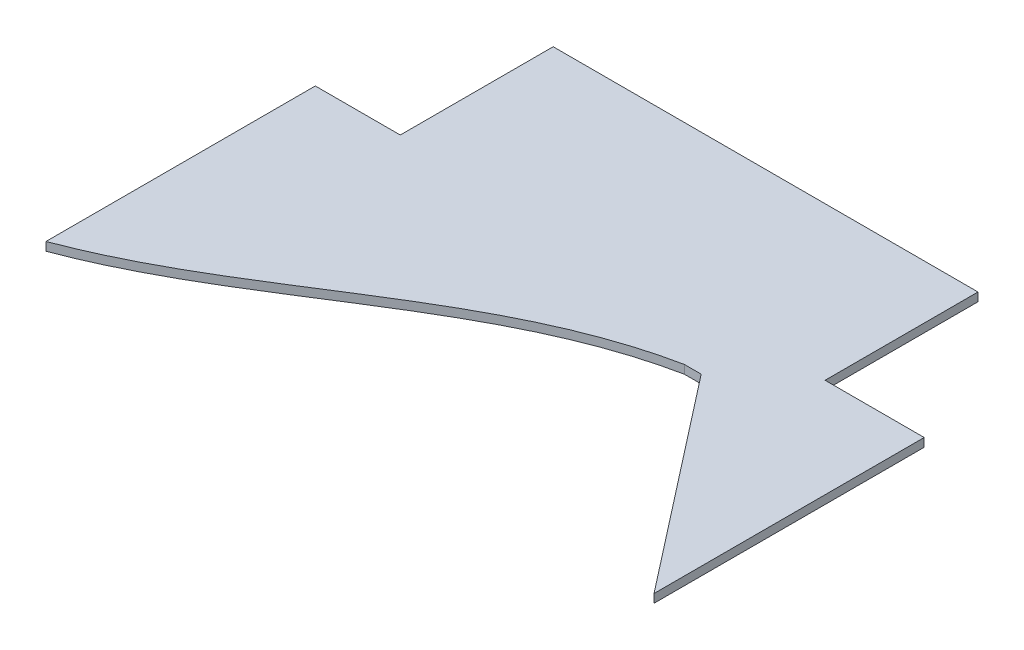
ISO-10303-21;
HEADER;
FILE_DESCRIPTION(('STEP AP214'),'2;1');
FILE_NAME('part.step','',(''),(''),'','','');
FILE_SCHEMA(('AUTOMOTIVE_DESIGN { 1 0 10303 214 1 1 1 1 }'));
ENDSEC;
DATA;
#1=APPLICATION_CONTEXT('core data for automotive mechanical design processes');
#2=APPLICATION_PROTOCOL_DEFINITION('international standard','automotive_design',2000,#1);
#3=PRODUCT_CONTEXT('',#1,'mechanical');
#4=PRODUCT('Part','Part','',(#3));
#5=PRODUCT_RELATED_PRODUCT_CATEGORY('part','',(#4));
#6=PRODUCT_DEFINITION_FORMATION('','',#4);
#7=PRODUCT_DEFINITION_CONTEXT('part definition',#1,'design');
#8=PRODUCT_DEFINITION('design','',#6,#7);
#9=PRODUCT_DEFINITION_SHAPE('','',#8);
#10=(LENGTH_UNIT() NAMED_UNIT(*) SI_UNIT(.MILLI.,.METRE.));
#11=(NAMED_UNIT(*) PLANE_ANGLE_UNIT() SI_UNIT($,.RADIAN.));
#12=(NAMED_UNIT(*) SI_UNIT($,.STERADIAN.) SOLID_ANGLE_UNIT());
#13=UNCERTAINTY_MEASURE_WITH_UNIT(LENGTH_MEASURE(1.E-05),#10,'distance_accuracy_value','');
#14=(GEOMETRIC_REPRESENTATION_CONTEXT(3) GLOBAL_UNCERTAINTY_ASSIGNED_CONTEXT((#13)) GLOBAL_UNIT_ASSIGNED_CONTEXT((#10,
#11,#12)) REPRESENTATION_CONTEXT('',''));
#15=CARTESIAN_POINT('',(0.,0.,0.));
#16=DIRECTION('',(0.,0.,1.));
#17=DIRECTION('',(1.,0.,0.));
#18=AXIS2_PLACEMENT_3D('',#15,#16,#17);
#19=CARTESIAN_POINT('',(0.,3.,37.));
#20=DIRECTION('',(0.,0.,-1.));
#21=DIRECTION('',(-1.,0.,0.));
#22=AXIS2_PLACEMENT_3D('',#19,#20,#21);
#23=PLANE('',#22);
#24=DIRECTION('',(1.,0.,0.));
#25=VECTOR('',#24,1.);
#26=CARTESIAN_POINT('',(0.,0.,37.));
#27=LINE('',#26,#25);
#28=CARTESIAN_POINT('',(45.2815368724361,0.,37.));
#29=VERTEX_POINT('',#28);
#30=CARTESIAN_POINT('',(51.2597077226073,0.,37.));
#31=VERTEX_POINT('',#30);
#32=EDGE_CURVE('E153',#29,#31,#27,.T.);
#33=ORIENTED_EDGE('',*,*,#32,.T.);
#34=DIRECTION('',(0.,-1.,0.));
#35=VECTOR('',#34,1.);
#36=CARTESIAN_POINT('',(51.2597077226073,3.,37.));
#37=LINE('',#36,#35);
#38=CARTESIAN_POINT('',(51.2597077226073,3.,37.));
#39=VERTEX_POINT('',#38);
#40=EDGE_CURVE('E161',#39,#31,#37,.T.);
#41=ORIENTED_EDGE('',*,*,#40,.F.);
#42=DIRECTION('',(1.,0.,0.));
#43=VECTOR('',#42,1.);
#44=CARTESIAN_POINT('',(0.,3.,37.));
#45=LINE('',#44,#43);
#46=CARTESIAN_POINT('',(45.2815368724361,3.,37.));
#47=VERTEX_POINT('',#46);
#48=EDGE_CURVE('E244',#47,#39,#45,.T.);
#49=ORIENTED_EDGE('',*,*,#48,.F.);
#50=DIRECTION('',(0.,-1.,0.));
#51=VECTOR('',#50,1.);
#52=CARTESIAN_POINT('',(45.2815368724361,3.,37.));
#53=LINE('',#52,#51);
#54=EDGE_CURVE('E103',#47,#29,#53,.T.);
#55=ORIENTED_EDGE('',*,*,#54,.T.);
#56=EDGE_LOOP('',(#33,#41,#49,#55));
#57=FACE_BOUND('',#56,.T.);
#58=ADVANCED_FACE('F92',(#57),#23,.F.);
#59=CARTESIAN_POINT('',(13.9585236221547,3.,-10.8754907942065));
#60=DIRECTION('',(-0.788835383712181,0.,0.614604537408939));
#61=DIRECTION('',(0.614604537408939,0.,0.788835383712181));
#62=AXIS2_PLACEMENT_3D('',#59,#60,#61);
#63=PLANE('',#62);
#64=DIRECTION('',(-0.614604537408939,0.,-0.788835383712181));
#65=VECTOR('',#64,1.);
#66=CARTESIAN_POINT('',(13.9585236221547,0.,-10.8754907942065));
#67=LINE('',#66,#65);
#68=CARTESIAN_POINT('',(110.,0.,112.392253355871));
#69=VERTEX_POINT('',#68);
#70=EDGE_CURVE('E207',#69,#31,#67,.T.);
#71=ORIENTED_EDGE('',*,*,#70,.F.);
#72=DIRECTION('',(0.,-1.,0.));
#73=VECTOR('',#72,1.);
#74=CARTESIAN_POINT('',(110.,3.,112.392253355871));
#75=LINE('',#74,#73);
#76=CARTESIAN_POINT('',(110.,3.,112.392253355871));
#77=VERTEX_POINT('',#76);
#78=EDGE_CURVE('E165',#77,#69,#75,.T.);
#79=ORIENTED_EDGE('',*,*,#78,.F.);
#80=DIRECTION('',(-0.614604537408939,0.,-0.788835383712181));
#81=VECTOR('',#80,1.);
#82=CARTESIAN_POINT('',(13.9585236221547,3.,-10.8754907942065));
#83=LINE('',#82,#81);
#84=EDGE_CURVE('E240',#77,#39,#83,.T.);
#85=ORIENTED_EDGE('',*,*,#84,.T.);
#86=ORIENTED_EDGE('',*,*,#40,.T.);
#87=EDGE_LOOP('',(#71,#79,#85,#86));
#88=FACE_BOUND('',#87,.T.);
#89=ADVANCED_FACE('F262',(#88),#63,.T.);
#90=CARTESIAN_POINT('',(110.,3.,0.));
#91=DIRECTION('',(1.,0.,0.));
#92=DIRECTION('',(0.,0.,-1.));
#93=AXIS2_PLACEMENT_3D('',#90,#91,#92);
#94=PLANE('',#93);
#95=DIRECTION('',(0.,0.,1.));
#96=VECTOR('',#95,1.);
#97=CARTESIAN_POINT('',(110.,0.,0.));
#98=LINE('',#97,#96);
#99=CARTESIAN_POINT('',(110.,0.,17.));
#100=VERTEX_POINT('',#99);
#101=EDGE_CURVE('E203',#100,#69,#98,.T.);
#102=ORIENTED_EDGE('',*,*,#101,.F.);
#103=DIRECTION('',(0.,-1.,0.));
#104=VECTOR('',#103,1.);
#105=CARTESIAN_POINT('',(110.,3.,17.));
#106=LINE('',#105,#104);
#107=CARTESIAN_POINT('',(110.,3.,17.));
#108=VERTEX_POINT('',#107);
#109=EDGE_CURVE('E169',#108,#100,#106,.T.);
#110=ORIENTED_EDGE('',*,*,#109,.F.);
#111=DIRECTION('',(0.,0.,1.));
#112=VECTOR('',#111,1.);
#113=CARTESIAN_POINT('',(110.,3.,0.));
#114=LINE('',#113,#112);
#115=EDGE_CURVE('E236',#108,#77,#114,.T.);
#116=ORIENTED_EDGE('',*,*,#115,.T.);
#117=ORIENTED_EDGE('',*,*,#78,.T.);
#118=EDGE_LOOP('',(#102,#110,#116,#117));
#119=FACE_BOUND('',#118,.T.);
#120=ADVANCED_FACE('F266',(#119),#94,.T.);
#121=CARTESIAN_POINT('',(0.,3.,17.));
#122=DIRECTION('',(0.,0.,-1.));
#123=DIRECTION('',(-1.,0.,0.));
#124=AXIS2_PLACEMENT_3D('',#121,#122,#123);
#125=PLANE('',#124);
#126=DIRECTION('',(1.,0.,0.));
#127=VECTOR('',#126,1.);
#128=CARTESIAN_POINT('',(0.,0.,17.));
#129=LINE('',#128,#127);
#130=CARTESIAN_POINT('',(75.,0.,17.));
#131=VERTEX_POINT('',#130);
#132=EDGE_CURVE('E199',#131,#100,#129,.T.);
#133=ORIENTED_EDGE('',*,*,#132,.F.);
#134=DIRECTION('',(0.,-1.,0.));
#135=VECTOR('',#134,1.);
#136=CARTESIAN_POINT('',(75.,3.,17.));
#137=LINE('',#136,#135);
#138=CARTESIAN_POINT('',(75.,3.,17.));
#139=VERTEX_POINT('',#138);
#140=EDGE_CURVE('E173',#139,#131,#137,.T.);
#141=ORIENTED_EDGE('',*,*,#140,.F.);
#142=DIRECTION('',(1.,0.,0.));
#143=VECTOR('',#142,1.);
#144=CARTESIAN_POINT('',(0.,3.,17.));
#145=LINE('',#144,#143);
#146=EDGE_CURVE('E232',#139,#108,#145,.T.);
#147=ORIENTED_EDGE('',*,*,#146,.T.);
#148=ORIENTED_EDGE('',*,*,#109,.T.);
#149=EDGE_LOOP('',(#133,#141,#147,#148));
#150=FACE_BOUND('',#149,.T.);
#151=ADVANCED_FACE('F270',(#150),#125,.T.);
#152=CARTESIAN_POINT('',(75.,3.,0.));
#153=DIRECTION('',(-1.,0.,0.));
#154=DIRECTION('',(0.,0.,1.));
#155=AXIS2_PLACEMENT_3D('',#152,#153,#154);
#156=PLANE('',#155);
#157=DIRECTION('',(0.,0.,-1.));
#158=VECTOR('',#157,1.);
#159=CARTESIAN_POINT('',(75.,0.,0.));
#160=LINE('',#159,#158);
#161=CARTESIAN_POINT('',(75.,0.,-37.));
#162=VERTEX_POINT('',#161);
#163=EDGE_CURVE('E195',#131,#162,#160,.T.);
#164=ORIENTED_EDGE('',*,*,#163,.T.);
#165=DIRECTION('',(0.,-1.,0.));
#166=VECTOR('',#165,1.);
#167=CARTESIAN_POINT('',(75.,3.,-37.));
#168=LINE('',#167,#166);
#169=CARTESIAN_POINT('',(75.,3.,-37.));
#170=VERTEX_POINT('',#169);
#171=EDGE_CURVE('E177',#170,#162,#168,.T.);
#172=ORIENTED_EDGE('',*,*,#171,.F.);
#173=DIRECTION('',(0.,0.,-1.));
#174=VECTOR('',#173,1.);
#175=CARTESIAN_POINT('',(75.,3.,0.));
#176=LINE('',#175,#174);
#177=EDGE_CURVE('E228',#139,#170,#176,.T.);
#178=ORIENTED_EDGE('',*,*,#177,.F.);
#179=ORIENTED_EDGE('',*,*,#140,.T.);
#180=EDGE_LOOP('',(#164,#172,#178,#179));
#181=FACE_BOUND('',#180,.T.);
#182=ADVANCED_FACE('F274',(#181),#156,.F.);
#183=CARTESIAN_POINT('',(0.,3.,-37.));
#184=DIRECTION('',(0.,0.,-1.));
#185=DIRECTION('',(-1.,0.,0.));
#186=AXIS2_PLACEMENT_3D('',#183,#184,#185);
#187=PLANE('',#186);
#188=DIRECTION('',(1.,0.,0.));
#189=VECTOR('',#188,1.);
#190=CARTESIAN_POINT('',(0.,0.,-37.));
#191=LINE('',#190,#189);
#192=CARTESIAN_POINT('',(-75.,0.,-37.));
#193=VERTEX_POINT('',#192);
#194=EDGE_CURVE('E191',#193,#162,#191,.T.);
#195=ORIENTED_EDGE('',*,*,#194,.F.);
#196=DIRECTION('',(0.,-1.,0.));
#197=VECTOR('',#196,1.);
#198=CARTESIAN_POINT('',(-75.,3.,-37.));
#199=LINE('',#198,#197);
#200=CARTESIAN_POINT('',(-75.,3.,-37.));
#201=VERTEX_POINT('',#200);
#202=EDGE_CURVE('E181',#201,#193,#199,.T.);
#203=ORIENTED_EDGE('',*,*,#202,.F.);
#204=DIRECTION('',(1.,0.,0.));
#205=VECTOR('',#204,1.);
#206=CARTESIAN_POINT('',(0.,3.,-37.));
#207=LINE('',#206,#205);
#208=EDGE_CURVE('E224',#201,#170,#207,.T.);
#209=ORIENTED_EDGE('',*,*,#208,.T.);
#210=ORIENTED_EDGE('',*,*,#171,.T.);
#211=EDGE_LOOP('',(#195,#203,#209,#210));
#212=FACE_BOUND('',#211,.T.);
#213=ADVANCED_FACE('F278',(#212),#187,.T.);
#214=CARTESIAN_POINT('',(-75.,3.,0.));
#215=DIRECTION('',(1.,0.,0.));
#216=DIRECTION('',(0.,0.,-1.));
#217=AXIS2_PLACEMENT_3D('',#214,#215,#216);
#218=PLANE('',#217);
#219=DIRECTION('',(0.,-1.,0.));
#220=VECTOR('',#219,1.);
#221=CARTESIAN_POINT('',(-75.,3.,17.));
#222=LINE('',#221,#220);
#223=CARTESIAN_POINT('',(-75.,3.,17.));
#224=VERTEX_POINT('',#223);
#225=CARTESIAN_POINT('',(-75.,0.,17.));
#226=VERTEX_POINT('',#225);
#227=EDGE_CURVE('E12',#224,#226,#222,.T.);
#228=ORIENTED_EDGE('',*,*,#227,.F.);
#229=DIRECTION('',(0.,0.,1.));
#230=VECTOR('',#229,1.);
#231=CARTESIAN_POINT('',(-75.,3.,0.));
#232=LINE('',#231,#230);
#233=EDGE_CURVE('E221',#201,#224,#232,.T.);
#234=ORIENTED_EDGE('',*,*,#233,.F.);
#235=ORIENTED_EDGE('',*,*,#202,.T.);
#236=DIRECTION('',(0.,0.,1.));
#237=VECTOR('',#236,1.);
#238=CARTESIAN_POINT('',(-75.,0.,0.));
#239=LINE('',#238,#237);
#240=EDGE_CURVE('E143',#193,#226,#239,.T.);
#241=ORIENTED_EDGE('',*,*,#240,.T.);
#242=EDGE_LOOP('',(#228,#234,#235,#241));
#243=FACE_BOUND('',#242,.T.);
#244=ADVANCED_FACE('F282',(#243),#218,.F.);
#245=CARTESIAN_POINT('',(-105.,3.,0.));
#246=DIRECTION('',(-1.,0.,0.));
#247=DIRECTION('',(0.,0.,1.));
#248=AXIS2_PLACEMENT_3D('',#245,#246,#247);
#249=PLANE('',#248);
#250=DIRECTION('',(0.,0.,-1.));
#251=VECTOR('',#250,1.);
#252=CARTESIAN_POINT('',(-105.,0.,0.));
#253=LINE('',#252,#251);
#254=CARTESIAN_POINT('',(-105.,0.,112.092029096166));
#255=VERTEX_POINT('',#254);
#256=CARTESIAN_POINT('',(-105.,0.,17.));
#257=VERTEX_POINT('',#256);
#258=EDGE_CURVE('E132',#255,#257,#253,.T.);
#259=ORIENTED_EDGE('',*,*,#258,.F.);
#260=DIRECTION('',(0.,-1.,0.));
#261=VECTOR('',#260,1.);
#262=CARTESIAN_POINT('',(-105.,3.,112.092029096166));
#263=LINE('',#262,#261);
#264=CARTESIAN_POINT('',(-105.,3.,112.092029096166));
#265=VERTEX_POINT('',#264);
#266=EDGE_CURVE('E185',#265,#255,#263,.T.);
#267=ORIENTED_EDGE('',*,*,#266,.F.);
#268=DIRECTION('',(0.,0.,-1.));
#269=VECTOR('',#268,1.);
#270=CARTESIAN_POINT('',(-105.,3.,0.));
#271=LINE('',#270,#269);
#272=CARTESIAN_POINT('',(-105.,3.,17.));
#273=VERTEX_POINT('',#272);
#274=EDGE_CURVE('E122',#265,#273,#271,.T.);
#275=ORIENTED_EDGE('',*,*,#274,.T.);
#276=DIRECTION('',(0.,-1.,0.));
#277=VECTOR('',#276,1.);
#278=CARTESIAN_POINT('',(-105.,3.,17.));
#279=LINE('',#278,#277);
#280=EDGE_CURVE('E96',#273,#257,#279,.T.);
#281=ORIENTED_EDGE('',*,*,#280,.T.);
#282=EDGE_LOOP('',(#259,#267,#275,#281));
#283=FACE_BOUND('',#282,.T.);
#284=ADVANCED_FACE('F149',(#283),#249,.T.);
#285=CARTESIAN_POINT('',(45.2815368724361,3.,37.));
#286=CARTESIAN_POINT('',(-12.2847261770679,3.,48.6891745159624));
#287=CARTESIAN_POINT('',(-51.8248307499673,3.,92.3041226199073));
#288=CARTESIAN_POINT('',(-105.,3.,112.092029096166));
#289=B_SPLINE_CURVE_WITH_KNOTS('',3,(#285,#286,#287,#288),.UNSPECIFIED.,.F.,.F.,(4,4),(0.,1.),.UNSPECIFIED.);
#290=DIRECTION('',(0.,-1.,0.));
#291=VECTOR('',#290,1.);
#292=SURFACE_OF_LINEAR_EXTRUSION('',#289,#291);
#293=CARTESIAN_POINT('',(45.2815368724361,0.,37.));
#294=CARTESIAN_POINT('',(-12.2847261770679,0.,48.6891745159624));
#295=CARTESIAN_POINT('',(-51.8248307499673,0.,92.3041226199073));
#296=CARTESIAN_POINT('',(-105.,0.,112.092029096166));
#297=B_SPLINE_CURVE_WITH_KNOTS('',3,(#293,#294,#295,#296),.UNSPECIFIED.,.F.,.F.,(4,4),(0.,1.),.UNSPECIFIED.);
#298=EDGE_CURVE('E140',#29,#255,#297,.T.);
#299=ORIENTED_EDGE('',*,*,#298,.F.);
#300=ORIENTED_EDGE('',*,*,#54,.F.);
#301=EDGE_CURVE('E142',#47,#265,#289,.T.);
#302=ORIENTED_EDGE('',*,*,#301,.T.);
#303=ORIENTED_EDGE('',*,*,#266,.T.);
#304=EDGE_LOOP('',(#299,#300,#302,#303));
#305=FACE_BOUND('',#304,.T.);
#306=ADVANCED_FACE('F256',(#305),#292,.T.);
#307=CARTESIAN_POINT('',(0.,0.,0.));
#308=DIRECTION('',(0.,1.,0.));
#309=DIRECTION('',(0.,0.,1.));
#310=AXIS2_PLACEMENT_3D('',#307,#308,#309);
#311=PLANE('',#310);
#312=ORIENTED_EDGE('',*,*,#298,.T.);
#313=ORIENTED_EDGE('',*,*,#258,.T.);
#314=DIRECTION('',(-1.,0.,0.));
#315=VECTOR('',#314,1.);
#316=CARTESIAN_POINT('',(-75.,0.,17.));
#317=LINE('',#316,#315);
#318=EDGE_CURVE('E136',#226,#257,#317,.T.);
#319=ORIENTED_EDGE('',*,*,#318,.F.);
#320=ORIENTED_EDGE('',*,*,#240,.F.);
#321=ORIENTED_EDGE('',*,*,#194,.T.);
#322=ORIENTED_EDGE('',*,*,#163,.F.);
#323=ORIENTED_EDGE('',*,*,#132,.T.);
#324=ORIENTED_EDGE('',*,*,#101,.T.);
#325=ORIENTED_EDGE('',*,*,#70,.T.);
#326=ORIENTED_EDGE('',*,*,#32,.F.);
#327=EDGE_LOOP('',(#312,#313,#319,#320,#321,#322,#323,#324,#325,#326));
#328=FACE_BOUND('',#327,.T.);
#329=ADVANCED_FACE('F134',(#328),#311,.F.);
#330=CARTESIAN_POINT('',(0.,3.,0.));
#331=DIRECTION('',(0.,1.,0.));
#332=DIRECTION('',(0.,0.,1.));
#333=AXIS2_PLACEMENT_3D('',#330,#331,#332);
#334=PLANE('',#333);
#335=ORIENTED_EDGE('',*,*,#301,.F.);
#336=ORIENTED_EDGE('',*,*,#48,.T.);
#337=ORIENTED_EDGE('',*,*,#84,.F.);
#338=ORIENTED_EDGE('',*,*,#115,.F.);
#339=ORIENTED_EDGE('',*,*,#146,.F.);
#340=ORIENTED_EDGE('',*,*,#177,.T.);
#341=ORIENTED_EDGE('',*,*,#208,.F.);
#342=ORIENTED_EDGE('',*,*,#233,.T.);
#343=DIRECTION('',(-1.,0.,0.));
#344=VECTOR('',#343,1.);
#345=CARTESIAN_POINT('',(-75.,3.,17.));
#346=LINE('',#345,#344);
#347=EDGE_CURVE('E148',#224,#273,#346,.T.);
#348=ORIENTED_EDGE('',*,*,#347,.T.);
#349=ORIENTED_EDGE('',*,*,#274,.F.);
#350=EDGE_LOOP('',(#335,#336,#337,#338,#339,#340,#341,#342,#348,#349));
#351=FACE_BOUND('',#350,.T.);
#352=ADVANCED_FACE('F290',(#351),#334,.T.);
#353=CARTESIAN_POINT('',(-75.,3.,17.));
#354=DIRECTION('',(0.,0.,1.));
#355=DIRECTION('',(1.,0.,0.));
#356=AXIS2_PLACEMENT_3D('',#353,#354,#355);
#357=PLANE('',#356);
#358=ORIENTED_EDGE('',*,*,#318,.T.);
#359=ORIENTED_EDGE('',*,*,#280,.F.);
#360=ORIENTED_EDGE('',*,*,#347,.F.);
#361=ORIENTED_EDGE('',*,*,#227,.T.);
#362=EDGE_LOOP('',(#358,#359,#360,#361));
#363=FACE_BOUND('',#362,.T.);
#364=ADVANCED_FACE('F94',(#363),#357,.F.);
#365=CLOSED_SHELL('',(#58,#89,#120,#151,#182,#213,#244,#284,#306,#329,#352,#364));
#366=MANIFOLD_SOLID_BREP('B2',#365);
#367=ADVANCED_BREP_SHAPE_REPRESENTATION('',(#18,#366),#14);
#368=SHAPE_DEFINITION_REPRESENTATION(#9,#367);
ENDSEC;
END-ISO-10303-21;
